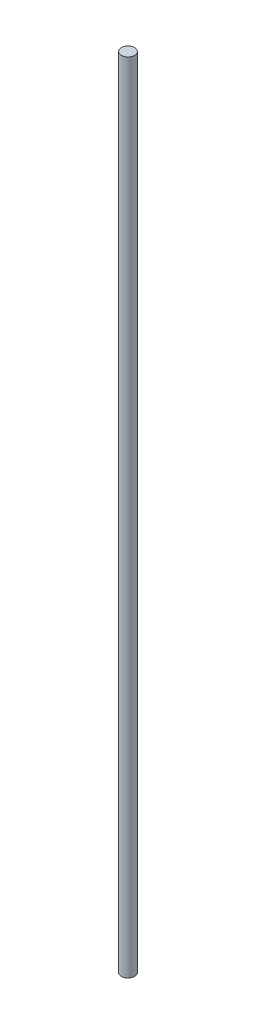
ISO-10303-21;
HEADER;
FILE_DESCRIPTION(('STEP AP214'),'2;1');
FILE_NAME('part.step','',(''),(''),'','','');
FILE_SCHEMA(('AUTOMOTIVE_DESIGN { 1 0 10303 214 1 1 1 1 }'));
ENDSEC;
DATA;
#1=APPLICATION_CONTEXT('core data for automotive mechanical design processes');
#2=APPLICATION_PROTOCOL_DEFINITION('international standard','automotive_design',2000,#1);
#3=PRODUCT_CONTEXT('',#1,'mechanical');
#4=PRODUCT('Part','Part','',(#3));
#5=PRODUCT_RELATED_PRODUCT_CATEGORY('part','',(#4));
#6=PRODUCT_DEFINITION_FORMATION('','',#4);
#7=PRODUCT_DEFINITION_CONTEXT('part definition',#1,'design');
#8=PRODUCT_DEFINITION('design','',#6,#7);
#9=PRODUCT_DEFINITION_SHAPE('','',#8);
#10=(LENGTH_UNIT() NAMED_UNIT(*) SI_UNIT(.MILLI.,.METRE.));
#11=(NAMED_UNIT(*) PLANE_ANGLE_UNIT() SI_UNIT($,.RADIAN.));
#12=(NAMED_UNIT(*) SI_UNIT($,.STERADIAN.) SOLID_ANGLE_UNIT());
#13=UNCERTAINTY_MEASURE_WITH_UNIT(LENGTH_MEASURE(1.E-05),#10,'distance_accuracy_value','');
#14=(GEOMETRIC_REPRESENTATION_CONTEXT(3) GLOBAL_UNCERTAINTY_ASSIGNED_CONTEXT((#13)) GLOBAL_UNIT_ASSIGNED_CONTEXT((#10,
#11,#12)) REPRESENTATION_CONTEXT('',''));
#15=CARTESIAN_POINT('',(0.,0.,0.));
#16=DIRECTION('',(0.,0.,1.));
#17=DIRECTION('',(1.,0.,0.));
#18=AXIS2_PLACEMENT_3D('',#15,#16,#17);
#19=CARTESIAN_POINT('',(0.,120.65,0.));
#20=DIRECTION('',(0.,-1.,0.));
#21=DIRECTION('',(0.,0.,-1.));
#22=AXIS2_PLACEMENT_3D('',#19,#20,#21);
#23=CYLINDRICAL_SURFACE('',#22,1.016);
#24=CARTESIAN_POINT('',(0.,120.65,0.));
#25=DIRECTION('',(0.,1.,0.));
#26=DIRECTION('',(0.,0.,1.));
#27=AXIS2_PLACEMENT_3D('',#24,#25,#26);
#28=CIRCLE('',#27,1.016);
#29=CARTESIAN_POINT('',(0.,120.65,-1.016));
#30=VERTEX_POINT('',#29);
#31=EDGE_CURVE('E10',#30,#30,#28,.T.);
#32=CARTESIAN_POINT('',(0.,0.,0.));
#33=DIRECTION('',(0.,1.,0.));
#34=DIRECTION('',(0.,0.,1.));
#35=AXIS2_PLACEMENT_3D('',#32,#33,#34);
#36=CIRCLE('',#35,1.016);
#37=CARTESIAN_POINT('',(0.,0.,-1.016));
#38=VERTEX_POINT('',#37);
#39=EDGE_CURVE('E32',#38,#38,#36,.T.);
#40=CARTESIAN_POINT('',(0.,120.65,-1.016));
#41=CARTESIAN_POINT('',(0.,119.393229166667,-1.016));
#42=CARTESIAN_POINT('',(0.,118.136458333333,-1.016));
#43=CARTESIAN_POINT('',(0.,115.622916666667,-1.016));
#44=CARTESIAN_POINT('',(0.,114.366145833333,-1.016));
#45=CARTESIAN_POINT('',(0.,111.852604166667,-1.016));
#46=CARTESIAN_POINT('',(0.,110.595833333333,-1.016));
#47=CARTESIAN_POINT('',(0.,108.082291666667,-1.016));
#48=CARTESIAN_POINT('',(0.,106.825520833333,-1.016));
#49=CARTESIAN_POINT('',(0.,104.311979166667,-1.016));
#50=CARTESIAN_POINT('',(0.,103.055208333333,-1.016));
#51=CARTESIAN_POINT('',(0.,100.541666666667,-1.016));
#52=CARTESIAN_POINT('',(0.,99.2848958333333,-1.016));
#53=CARTESIAN_POINT('',(0.,96.7713541666667,-1.016));
#54=CARTESIAN_POINT('',(0.,95.5145833333333,-1.016));
#55=CARTESIAN_POINT('',(0.,93.0010416666667,-1.016));
#56=CARTESIAN_POINT('',(0.,91.7442708333333,-1.016));
#57=CARTESIAN_POINT('',(0.,89.2307291666666,-1.016));
#58=CARTESIAN_POINT('',(0.,87.9739583333333,-1.016));
#59=CARTESIAN_POINT('',(0.,85.4604166666666,-1.016));
#60=CARTESIAN_POINT('',(0.,84.2036458333333,-1.016));
#61=CARTESIAN_POINT('',(0.,81.6901041666667,-1.016));
#62=CARTESIAN_POINT('',(0.,80.4333333333333,-1.016));
#63=CARTESIAN_POINT('',(0.,77.9197916666667,-1.016));
#64=CARTESIAN_POINT('',(0.,76.6630208333333,-1.016));
#65=CARTESIAN_POINT('',(0.,74.1494791666667,-1.016));
#66=CARTESIAN_POINT('',(0.,72.8927083333333,-1.016));
#67=CARTESIAN_POINT('',(0.,70.3791666666667,-1.016));
#68=CARTESIAN_POINT('',(0.,69.1223958333333,-1.016));
#69=CARTESIAN_POINT('',(0.,66.6088541666666,-1.016));
#70=CARTESIAN_POINT('',(0.,65.3520833333333,-1.016));
#71=CARTESIAN_POINT('',(0.,62.8385416666667,-1.016));
#72=CARTESIAN_POINT('',(0.,61.5817708333333,-1.016));
#73=CARTESIAN_POINT('',(0.,59.0682291666667,-1.016));
#74=CARTESIAN_POINT('',(0.,57.8114583333333,-1.016));
#75=CARTESIAN_POINT('',(0.,55.2979166666667,-1.016));
#76=CARTESIAN_POINT('',(0.,54.0411458333333,-1.016));
#77=CARTESIAN_POINT('',(0.,51.5276041666667,-1.016));
#78=CARTESIAN_POINT('',(0.,50.2708333333333,-1.016));
#79=CARTESIAN_POINT('',(0.,47.7572916666667,-1.016));
#80=CARTESIAN_POINT('',(0.,46.5005208333333,-1.016));
#81=CARTESIAN_POINT('',(0.,43.9869791666667,-1.016));
#82=CARTESIAN_POINT('',(0.,42.7302083333333,-1.016));
#83=CARTESIAN_POINT('',(0.,40.2166666666667,-1.016));
#84=CARTESIAN_POINT('',(0.,38.9598958333333,-1.016));
#85=CARTESIAN_POINT('',(0.,36.4463541666667,-1.016));
#86=CARTESIAN_POINT('',(0.,35.1895833333333,-1.016));
#87=CARTESIAN_POINT('',(0.,32.6760416666667,-1.016));
#88=CARTESIAN_POINT('',(0.,31.4192708333333,-1.016));
#89=CARTESIAN_POINT('',(0.,28.9057291666667,-1.016));
#90=CARTESIAN_POINT('',(0.,27.6489583333333,-1.016));
#91=CARTESIAN_POINT('',(0.,25.1354166666667,-1.016));
#92=CARTESIAN_POINT('',(0.,23.8786458333333,-1.016));
#93=CARTESIAN_POINT('',(0.,21.3651041666667,-1.016));
#94=CARTESIAN_POINT('',(0.,20.1083333333333,-1.016));
#95=CARTESIAN_POINT('',(0.,17.5947916666667,-1.016));
#96=CARTESIAN_POINT('',(0.,16.3380208333333,-1.016));
#97=CARTESIAN_POINT('',(0.,13.8244791666667,-1.016));
#98=CARTESIAN_POINT('',(0.,12.5677083333333,-1.016));
#99=CARTESIAN_POINT('',(0.,10.0541666666667,-1.016));
#100=CARTESIAN_POINT('',(0.,8.79739583333333,-1.016));
#101=CARTESIAN_POINT('',(0.,6.28385416666666,-1.016));
#102=CARTESIAN_POINT('',(0.,5.02708333333333,-1.016));
#103=CARTESIAN_POINT('',(0.,2.51354166666666,-1.016));
#104=CARTESIAN_POINT('',(0.,1.25677083333333,-1.016));
#105=CARTESIAN_POINT('',(0.,0.,-1.016));
#106=B_SPLINE_CURVE_WITH_KNOTS('',3,(#40,#41,#42,#43,#44,#45,#46,#47,#48,#49,#50,#51,#52,#53,
#54,#55,#56,#57,#58,#59,#60,#61,#62,#63,#64,#65,#66,#67,#68,#69,#70,#71,#72,#73,#74,#75,#76,#77,
#78,#79,#80,#81,#82,#83,#84,#85,#86,#87,#88,#89,#90,#91,#92,#93,#94,#95,#96,#97,#98,#99,#100,
#101,#102,#103,#104,#105),.UNSPECIFIED.,.F.,.F.,(4,2,2,2,2,2,2,2,2,2,2,2,2,2,2,2,2,2,2,2,2,2,2,
2,2,2,2,2,2,2,2,2,4),(0.,3.77031250000001,7.54062500000001,11.3109375,15.08125,18.8515625,
22.621875,26.3921875,30.1625,33.9328125,37.703125,41.4734375,45.24375,49.0140625,52.784375,
56.5546875,60.325,64.0953125,67.865625,71.6359375,75.40625,79.1765625,82.946875,86.7171875,
90.4875,94.2578125,98.028125,101.7984375,105.56875,109.3390625,113.109375,116.8796875,120.65),.UNSPECIFIED.);
#107=EDGE_CURVE('BSEAM29',#30,#38,#106,.T.);
#108=ORIENTED_EDGE('',*,*,#31,.F.);
#109=ORIENTED_EDGE('',*,*,#39,.T.);
#110=ORIENTED_EDGE('',*,*,#107,.T.);
#111=ORIENTED_EDGE('',*,*,#107,.F.);
#112=EDGE_LOOP('',(#108,#110,#109,#111));
#113=FACE_BOUND('',#112,.T.);
#114=ADVANCED_FACE('F29',(#113),#23,.T.);
#115=CARTESIAN_POINT('',(0.,120.65,0.));
#116=DIRECTION('',(0.,1.,0.));
#117=DIRECTION('',(0.,0.,1.));
#118=AXIS2_PLACEMENT_3D('',#115,#116,#117);
#119=PLANE('',#118);
#120=ORIENTED_EDGE('',*,*,#31,.T.);
#121=EDGE_LOOP('',(#120));
#122=FACE_BOUND('',#121,.T.);
#123=ADVANCED_FACE('F44',(#122),#119,.T.);
#124=CARTESIAN_POINT('',(0.,0.,0.));
#125=DIRECTION('',(0.,1.,0.));
#126=DIRECTION('',(0.,0.,1.));
#127=AXIS2_PLACEMENT_3D('',#124,#125,#126);
#128=PLANE('',#127);
#129=ORIENTED_EDGE('',*,*,#39,.F.);
#130=EDGE_LOOP('',(#129));
#131=FACE_BOUND('',#130,.T.);
#132=ADVANCED_FACE('F42',(#131),#128,.F.);
#133=CLOSED_SHELL('',(#114,#123,#132));
#134=MANIFOLD_SOLID_BREP('B2',#133);
#135=ADVANCED_BREP_SHAPE_REPRESENTATION('',(#18,#134),#14);
#136=SHAPE_DEFINITION_REPRESENTATION(#9,#135);
ENDSEC;
END-ISO-10303-21;
